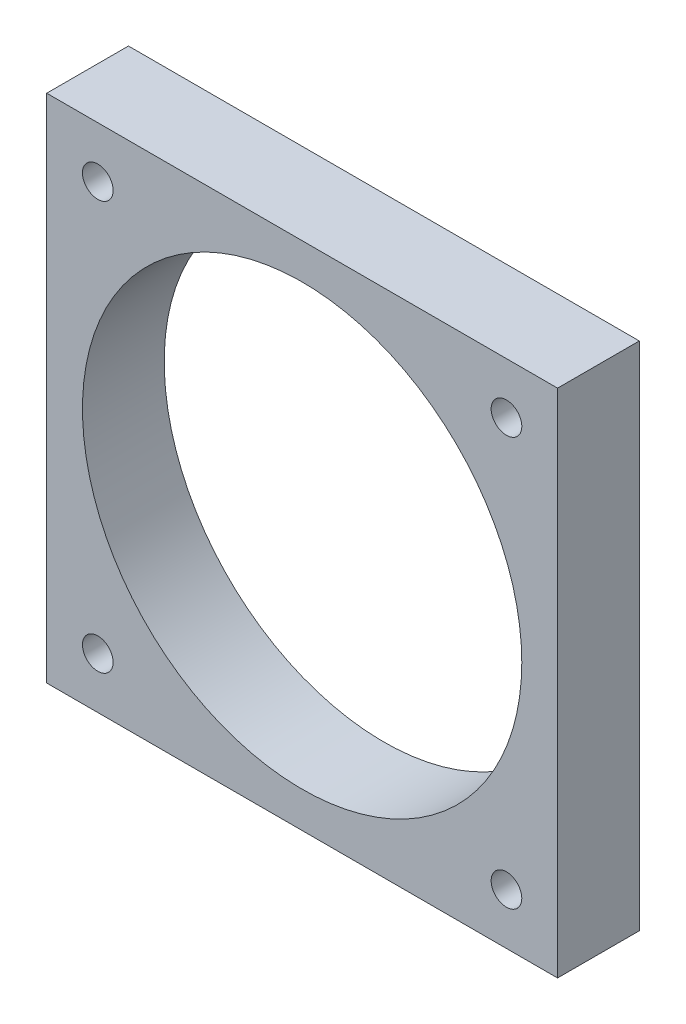
ISO-10303-21;
HEADER;
FILE_DESCRIPTION(('STEP AP214'),'2;1');
FILE_NAME('part.step','',(''),(''),'','','');
FILE_SCHEMA(('AUTOMOTIVE_DESIGN { 1 0 10303 214 1 1 1 1 }'));
ENDSEC;
DATA;
#1=APPLICATION_CONTEXT('core data for automotive mechanical design processes');
#2=APPLICATION_PROTOCOL_DEFINITION('international standard','automotive_design',2000,#1);
#3=PRODUCT_CONTEXT('',#1,'mechanical');
#4=PRODUCT('Part','Part','',(#3));
#5=PRODUCT_RELATED_PRODUCT_CATEGORY('part','',(#4));
#6=PRODUCT_DEFINITION_FORMATION('','',#4);
#7=PRODUCT_DEFINITION_CONTEXT('part definition',#1,'design');
#8=PRODUCT_DEFINITION('design','',#6,#7);
#9=PRODUCT_DEFINITION_SHAPE('','',#8);
#10=(LENGTH_UNIT() NAMED_UNIT(*) SI_UNIT(.MILLI.,.METRE.));
#11=(NAMED_UNIT(*) PLANE_ANGLE_UNIT() SI_UNIT($,.RADIAN.));
#12=(NAMED_UNIT(*) SI_UNIT($,.STERADIAN.) SOLID_ANGLE_UNIT());
#13=UNCERTAINTY_MEASURE_WITH_UNIT(LENGTH_MEASURE(1.E-05),#10,'distance_accuracy_value','');
#14=(GEOMETRIC_REPRESENTATION_CONTEXT(3) GLOBAL_UNCERTAINTY_ASSIGNED_CONTEXT((#13)) GLOBAL_UNIT_ASSIGNED_CONTEXT((#10,
#11,#12)) REPRESENTATION_CONTEXT('',''));
#15=CARTESIAN_POINT('',(0.,0.,0.));
#16=DIRECTION('',(0.,0.,1.));
#17=DIRECTION('',(1.,0.,0.));
#18=AXIS2_PLACEMENT_3D('',#15,#16,#17);
#19=CARTESIAN_POINT('',(0.,0.,8.));
#20=DIRECTION('',(0.,0.,1.));
#21=DIRECTION('',(1.,0.,0.));
#22=AXIS2_PLACEMENT_3D('',#19,#20,#21);
#23=PLANE('',#22);
#24=CARTESIAN_POINT('',(20.,-20.,8.));
#25=DIRECTION('',(0.,0.,1.));
#26=DIRECTION('',(1.,0.,0.));
#27=AXIS2_PLACEMENT_3D('',#24,#25,#26);
#28=CIRCLE('',#27,1.5);
#29=CARTESIAN_POINT('',(21.5,-20.,8.));
#30=VERTEX_POINT('',#29);
#31=EDGE_CURVE('E128',#30,#30,#28,.T.);
#32=ORIENTED_EDGE('',*,*,#31,.F.);
#33=EDGE_LOOP('',(#32));
#34=FACE_BOUND('',#33,.T.);
#35=CARTESIAN_POINT('',(-20.,20.,8.));
#36=DIRECTION('',(0.,0.,1.));
#37=DIRECTION('',(1.,0.,0.));
#38=AXIS2_PLACEMENT_3D('',#35,#36,#37);
#39=CIRCLE('',#38,1.5);
#40=CARTESIAN_POINT('',(-18.5,20.,8.));
#41=VERTEX_POINT('',#40);
#42=EDGE_CURVE('E116',#41,#41,#39,.T.);
#43=ORIENTED_EDGE('',*,*,#42,.F.);
#44=EDGE_LOOP('',(#43));
#45=FACE_BOUND('',#44,.T.);
#46=DIRECTION('',(0.,-1.,0.));
#47=VECTOR('',#46,1.);
#48=CARTESIAN_POINT('',(-25.,25.,8.));
#49=LINE('',#48,#47);
#50=CARTESIAN_POINT('',(-25.,25.,8.));
#51=VERTEX_POINT('',#50);
#52=CARTESIAN_POINT('',(-25.,-25.,8.));
#53=VERTEX_POINT('',#52);
#54=EDGE_CURVE('E86',#51,#53,#49,.T.);
#55=ORIENTED_EDGE('',*,*,#54,.T.);
#56=DIRECTION('',(1.,0.,0.));
#57=VECTOR('',#56,1.);
#58=CARTESIAN_POINT('',(-25.,-25.,8.));
#59=LINE('',#58,#57);
#60=CARTESIAN_POINT('',(25.,-25.,8.));
#61=VERTEX_POINT('',#60);
#62=EDGE_CURVE('E81',#53,#61,#59,.T.);
#63=ORIENTED_EDGE('',*,*,#62,.T.);
#64=DIRECTION('',(0.,1.,0.));
#65=VECTOR('',#64,1.);
#66=CARTESIAN_POINT('',(25.,25.,8.));
#67=LINE('',#66,#65);
#68=CARTESIAN_POINT('',(25.,25.,8.));
#69=VERTEX_POINT('',#68);
#70=EDGE_CURVE('E84',#61,#69,#67,.T.);
#71=ORIENTED_EDGE('',*,*,#70,.T.);
#72=DIRECTION('',(-1.,0.,0.));
#73=VECTOR('',#72,1.);
#74=CARTESIAN_POINT('',(-25.,25.,8.));
#75=LINE('',#74,#73);
#76=EDGE_CURVE('E51',#69,#51,#75,.T.);
#77=ORIENTED_EDGE('',*,*,#76,.T.);
#78=EDGE_LOOP('',(#55,#63,#71,#77));
#79=FACE_BOUND('',#78,.T.);
#80=CARTESIAN_POINT('',(0.,0.,8.));
#81=DIRECTION('',(0.,0.,1.));
#82=DIRECTION('',(1.,0.,0.));
#83=AXIS2_PLACEMENT_3D('',#80,#81,#82);
#84=CIRCLE('',#83,21.5);
#85=CARTESIAN_POINT('',(21.5,0.,8.));
#86=VERTEX_POINT('',#85);
#87=EDGE_CURVE('E101',#86,#86,#84,.T.);
#88=ORIENTED_EDGE('',*,*,#87,.F.);
#89=EDGE_LOOP('',(#88));
#90=FACE_BOUND('',#89,.T.);
#91=CARTESIAN_POINT('',(20.,20.,8.));
#92=DIRECTION('',(0.,0.,1.));
#93=DIRECTION('',(-1.,0.,0.));
#94=AXIS2_PLACEMENT_3D('',#91,#92,#93);
#95=CIRCLE('',#94,1.5);
#96=CARTESIAN_POINT('',(18.5,20.,8.));
#97=VERTEX_POINT('',#96);
#98=EDGE_CURVE('E122',#97,#97,#95,.T.);
#99=ORIENTED_EDGE('',*,*,#98,.F.);
#100=EDGE_LOOP('',(#99));
#101=FACE_BOUND('',#100,.T.);
#102=CARTESIAN_POINT('',(-20.,-20.,8.));
#103=DIRECTION('',(0.,0.,1.));
#104=DIRECTION('',(-1.,0.,0.));
#105=AXIS2_PLACEMENT_3D('',#102,#103,#104);
#106=CIRCLE('',#105,1.5);
#107=CARTESIAN_POINT('',(-21.5,-20.,8.));
#108=VERTEX_POINT('',#107);
#109=EDGE_CURVE('E134',#108,#108,#106,.T.);
#110=ORIENTED_EDGE('',*,*,#109,.F.);
#111=EDGE_LOOP('',(#110));
#112=FACE_BOUND('',#111,.T.);
#113=ADVANCED_FACE('F34',(#34,#45,#79,#90,#101,#112),#23,.T.);
#114=CARTESIAN_POINT('',(0.,0.,0.));
#115=DIRECTION('',(0.,0.,1.));
#116=DIRECTION('',(1.,0.,0.));
#117=AXIS2_PLACEMENT_3D('',#114,#115,#116);
#118=PLANE('',#117);
#119=CARTESIAN_POINT('',(20.,-20.,0.));
#120=DIRECTION('',(0.,0.,1.));
#121=DIRECTION('',(1.,0.,0.));
#122=AXIS2_PLACEMENT_3D('',#119,#120,#121);
#123=CIRCLE('',#122,1.5);
#124=CARTESIAN_POINT('',(21.5,-20.,0.));
#125=VERTEX_POINT('',#124);
#126=EDGE_CURVE('E131',#125,#125,#123,.T.);
#127=ORIENTED_EDGE('',*,*,#126,.T.);
#128=EDGE_LOOP('',(#127));
#129=FACE_BOUND('',#128,.T.);
#130=CARTESIAN_POINT('',(-20.,20.,0.));
#131=DIRECTION('',(0.,0.,1.));
#132=DIRECTION('',(1.,0.,0.));
#133=AXIS2_PLACEMENT_3D('',#130,#131,#132);
#134=CIRCLE('',#133,1.5);
#135=CARTESIAN_POINT('',(-18.5,20.,0.));
#136=VERTEX_POINT('',#135);
#137=EDGE_CURVE('E119',#136,#136,#134,.T.);
#138=ORIENTED_EDGE('',*,*,#137,.T.);
#139=EDGE_LOOP('',(#138));
#140=FACE_BOUND('',#139,.T.);
#141=DIRECTION('',(0.,-1.,0.));
#142=VECTOR('',#141,1.);
#143=CARTESIAN_POINT('',(-25.,25.,0.));
#144=LINE('',#143,#142);
#145=CARTESIAN_POINT('',(-25.,25.,0.));
#146=VERTEX_POINT('',#145);
#147=CARTESIAN_POINT('',(-25.,-25.,0.));
#148=VERTEX_POINT('',#147);
#149=EDGE_CURVE('E98',#146,#148,#144,.T.);
#150=ORIENTED_EDGE('',*,*,#149,.F.);
#151=DIRECTION('',(-1.,0.,0.));
#152=VECTOR('',#151,1.);
#153=CARTESIAN_POINT('',(-25.,25.,0.));
#154=LINE('',#153,#152);
#155=CARTESIAN_POINT('',(25.,25.,0.));
#156=VERTEX_POINT('',#155);
#157=EDGE_CURVE('E74',#156,#146,#154,.T.);
#158=ORIENTED_EDGE('',*,*,#157,.F.);
#159=DIRECTION('',(0.,1.,0.));
#160=VECTOR('',#159,1.);
#161=CARTESIAN_POINT('',(25.,25.,0.));
#162=LINE('',#161,#160);
#163=CARTESIAN_POINT('',(25.,-25.,0.));
#164=VERTEX_POINT('',#163);
#165=EDGE_CURVE('E68',#164,#156,#162,.T.);
#166=ORIENTED_EDGE('',*,*,#165,.F.);
#167=DIRECTION('',(1.,0.,0.));
#168=VECTOR('',#167,1.);
#169=CARTESIAN_POINT('',(-25.,-25.,0.));
#170=LINE('',#169,#168);
#171=EDGE_CURVE('E90',#148,#164,#170,.T.);
#172=ORIENTED_EDGE('',*,*,#171,.F.);
#173=EDGE_LOOP('',(#150,#158,#166,#172));
#174=FACE_BOUND('',#173,.T.);
#175=CARTESIAN_POINT('',(0.,0.,0.));
#176=DIRECTION('',(0.,0.,1.));
#177=DIRECTION('',(1.,0.,0.));
#178=AXIS2_PLACEMENT_3D('',#175,#176,#177);
#179=CIRCLE('',#178,21.5);
#180=CARTESIAN_POINT('',(21.5,0.,0.));
#181=VERTEX_POINT('',#180);
#182=EDGE_CURVE('E113',#181,#181,#179,.T.);
#183=ORIENTED_EDGE('',*,*,#182,.T.);
#184=EDGE_LOOP('',(#183));
#185=FACE_BOUND('',#184,.T.);
#186=CARTESIAN_POINT('',(20.,20.,0.));
#187=DIRECTION('',(0.,0.,1.));
#188=DIRECTION('',(-1.,0.,0.));
#189=AXIS2_PLACEMENT_3D('',#186,#187,#188);
#190=CIRCLE('',#189,1.5);
#191=CARTESIAN_POINT('',(18.5,20.,0.));
#192=VERTEX_POINT('',#191);
#193=EDGE_CURVE('E125',#192,#192,#190,.T.);
#194=ORIENTED_EDGE('',*,*,#193,.T.);
#195=EDGE_LOOP('',(#194));
#196=FACE_BOUND('',#195,.T.);
#197=CARTESIAN_POINT('',(-20.,-20.,0.));
#198=DIRECTION('',(0.,0.,1.));
#199=DIRECTION('',(-1.,0.,0.));
#200=AXIS2_PLACEMENT_3D('',#197,#198,#199);
#201=CIRCLE('',#200,1.5);
#202=CARTESIAN_POINT('',(-21.5,-20.,0.));
#203=VERTEX_POINT('',#202);
#204=EDGE_CURVE('E137',#203,#203,#201,.T.);
#205=ORIENTED_EDGE('',*,*,#204,.T.);
#206=EDGE_LOOP('',(#205));
#207=FACE_BOUND('',#206,.T.);
#208=ADVANCED_FACE('F109',(#129,#140,#174,#185,#196,#207),#118,.F.);
#209=CARTESIAN_POINT('',(-25.,25.,8.));
#210=DIRECTION('',(1.,0.,0.));
#211=DIRECTION('',(0.,1.,0.));
#212=AXIS2_PLACEMENT_3D('',#209,#210,#211);
#213=PLANE('',#212);
#214=ORIENTED_EDGE('',*,*,#149,.T.);
#215=DIRECTION('',(0.,0.,-1.));
#216=VECTOR('',#215,1.);
#217=CARTESIAN_POINT('',(-25.,-25.,8.));
#218=LINE('',#217,#216);
#219=EDGE_CURVE('E11',#53,#148,#218,.T.);
#220=ORIENTED_EDGE('',*,*,#219,.F.);
#221=ORIENTED_EDGE('',*,*,#54,.F.);
#222=DIRECTION('',(0.,0.,-1.));
#223=VECTOR('',#222,1.);
#224=CARTESIAN_POINT('',(-25.,25.,8.));
#225=LINE('',#224,#223);
#226=EDGE_CURVE('E94',#51,#146,#225,.T.);
#227=ORIENTED_EDGE('',*,*,#226,.T.);
#228=EDGE_LOOP('',(#214,#220,#221,#227));
#229=FACE_BOUND('',#228,.T.);
#230=ADVANCED_FACE('F36',(#229),#213,.F.);
#231=CARTESIAN_POINT('',(-25.,-25.,8.));
#232=DIRECTION('',(0.,1.,0.));
#233=DIRECTION('',(0.,0.,1.));
#234=AXIS2_PLACEMENT_3D('',#231,#232,#233);
#235=PLANE('',#234);
#236=ORIENTED_EDGE('',*,*,#171,.T.);
#237=DIRECTION('',(0.,0.,-1.));
#238=VECTOR('',#237,1.);
#239=CARTESIAN_POINT('',(25.,-25.,8.));
#240=LINE('',#239,#238);
#241=EDGE_CURVE('E43',#61,#164,#240,.T.);
#242=ORIENTED_EDGE('',*,*,#241,.F.);
#243=ORIENTED_EDGE('',*,*,#62,.F.);
#244=ORIENTED_EDGE('',*,*,#219,.T.);
#245=EDGE_LOOP('',(#236,#242,#243,#244));
#246=FACE_BOUND('',#245,.T.);
#247=ADVANCED_FACE('F89',(#246),#235,.F.);
#248=CARTESIAN_POINT('',(25.,25.,8.));
#249=DIRECTION('',(-1.,0.,0.));
#250=DIRECTION('',(0.,-1.,0.));
#251=AXIS2_PLACEMENT_3D('',#248,#249,#250);
#252=PLANE('',#251);
#253=ORIENTED_EDGE('',*,*,#165,.T.);
#254=DIRECTION('',(0.,0.,-1.));
#255=VECTOR('',#254,1.);
#256=CARTESIAN_POINT('',(25.,25.,8.));
#257=LINE('',#256,#255);
#258=EDGE_CURVE('E91',#69,#156,#257,.T.);
#259=ORIENTED_EDGE('',*,*,#258,.F.);
#260=ORIENTED_EDGE('',*,*,#70,.F.);
#261=ORIENTED_EDGE('',*,*,#241,.T.);
#262=EDGE_LOOP('',(#253,#259,#260,#261));
#263=FACE_BOUND('',#262,.T.);
#264=ADVANCED_FACE('F92',(#263),#252,.F.);
#265=CARTESIAN_POINT('',(-25.,25.,8.));
#266=DIRECTION('',(0.,-1.,0.));
#267=DIRECTION('',(0.,0.,-1.));
#268=AXIS2_PLACEMENT_3D('',#265,#266,#267);
#269=PLANE('',#268);
#270=ORIENTED_EDGE('',*,*,#157,.T.);
#271=ORIENTED_EDGE('',*,*,#226,.F.);
#272=ORIENTED_EDGE('',*,*,#76,.F.);
#273=ORIENTED_EDGE('',*,*,#258,.T.);
#274=EDGE_LOOP('',(#270,#271,#272,#273));
#275=FACE_BOUND('',#274,.T.);
#276=ADVANCED_FACE('F106',(#275),#269,.F.);
#277=CARTESIAN_POINT('',(0.,0.,8.));
#278=DIRECTION('',(0.,0.,-1.));
#279=DIRECTION('',(-1.,0.,0.));
#280=AXIS2_PLACEMENT_3D('',#277,#278,#279);
#281=CYLINDRICAL_SURFACE('',#280,21.5);
#282=ORIENTED_EDGE('',*,*,#87,.T.);
#283=EDGE_LOOP('',(#282));
#284=FACE_BOUND('',#283,.T.);
#285=ORIENTED_EDGE('',*,*,#182,.F.);
#286=EDGE_LOOP('',(#285));
#287=FACE_BOUND('',#286,.T.);
#288=ADVANCED_FACE('F157',(#284,#287),#281,.F.);
#289=CARTESIAN_POINT('',(-20.,20.,8.));
#290=DIRECTION('',(0.,0.,-1.));
#291=DIRECTION('',(-1.,0.,0.));
#292=AXIS2_PLACEMENT_3D('',#289,#290,#291);
#293=CYLINDRICAL_SURFACE('',#292,1.5);
#294=ORIENTED_EDGE('',*,*,#42,.T.);
#295=EDGE_LOOP('',(#294));
#296=FACE_BOUND('',#295,.T.);
#297=ORIENTED_EDGE('',*,*,#137,.F.);
#298=EDGE_LOOP('',(#297));
#299=FACE_BOUND('',#298,.T.);
#300=ADVANCED_FACE('F203',(#296,#299),#293,.F.);
#301=CARTESIAN_POINT('',(20.,20.,8.));
#302=DIRECTION('',(0.,0.,-1.));
#303=DIRECTION('',(-1.,0.,0.));
#304=AXIS2_PLACEMENT_3D('',#301,#302,#303);
#305=CYLINDRICAL_SURFACE('',#304,1.5);
#306=ORIENTED_EDGE('',*,*,#98,.T.);
#307=EDGE_LOOP('',(#306));
#308=FACE_BOUND('',#307,.T.);
#309=ORIENTED_EDGE('',*,*,#193,.F.);
#310=EDGE_LOOP('',(#309));
#311=FACE_BOUND('',#310,.T.);
#312=ADVANCED_FACE('F211',(#308,#311),#305,.F.);
#313=CARTESIAN_POINT('',(20.,-20.,8.));
#314=DIRECTION('',(0.,0.,-1.));
#315=DIRECTION('',(-1.,0.,0.));
#316=AXIS2_PLACEMENT_3D('',#313,#314,#315);
#317=CYLINDRICAL_SURFACE('',#316,1.5);
#318=ORIENTED_EDGE('',*,*,#31,.T.);
#319=EDGE_LOOP('',(#318));
#320=FACE_BOUND('',#319,.T.);
#321=ORIENTED_EDGE('',*,*,#126,.F.);
#322=EDGE_LOOP('',(#321));
#323=FACE_BOUND('',#322,.T.);
#324=ADVANCED_FACE('F219',(#320,#323),#317,.F.);
#325=CARTESIAN_POINT('',(-20.,-20.,8.));
#326=DIRECTION('',(0.,0.,-1.));
#327=DIRECTION('',(-1.,0.,0.));
#328=AXIS2_PLACEMENT_3D('',#325,#326,#327);
#329=CYLINDRICAL_SURFACE('',#328,1.5);
#330=ORIENTED_EDGE('',*,*,#109,.T.);
#331=EDGE_LOOP('',(#330));
#332=FACE_BOUND('',#331,.T.);
#333=ORIENTED_EDGE('',*,*,#204,.F.);
#334=EDGE_LOOP('',(#333));
#335=FACE_BOUND('',#334,.T.);
#336=ADVANCED_FACE('F143',(#332,#335),#329,.F.);
#337=CLOSED_SHELL('',(#113,#208,#230,#247,#264,#276,#288,#300,#312,#324,#336));
#338=MANIFOLD_SOLID_BREP('B2',#337);
#339=ADVANCED_BREP_SHAPE_REPRESENTATION('',(#18,#338),#14);
#340=SHAPE_DEFINITION_REPRESENTATION(#9,#339);
ENDSEC;
END-ISO-10303-21;
